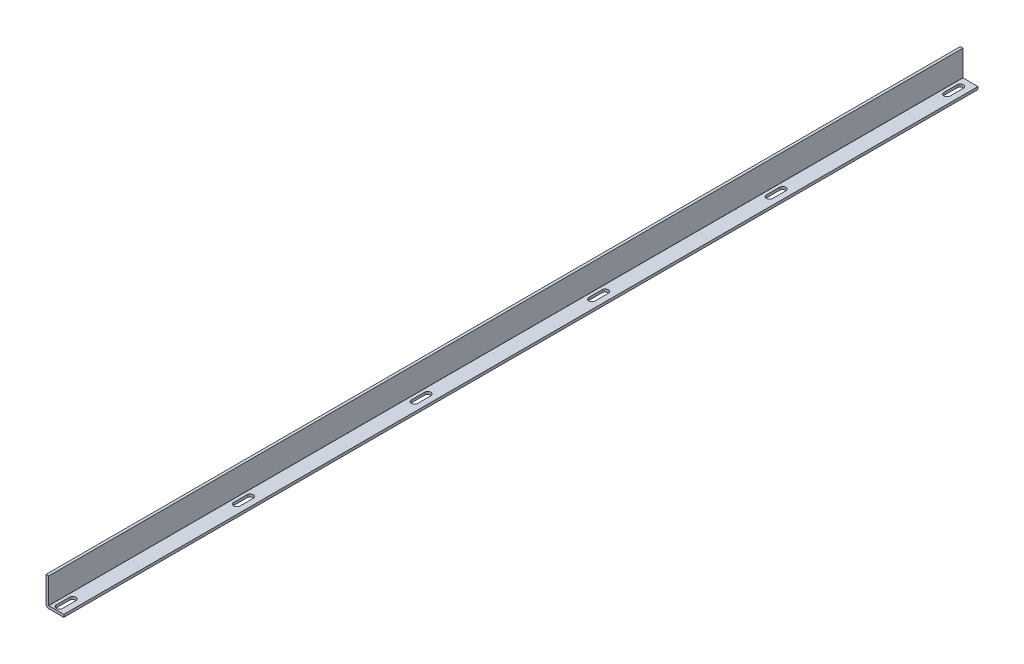
ISO-10303-21;
HEADER;
FILE_DESCRIPTION(('STEP AP214'),'2;1');
FILE_NAME('part.step','',(''),(''),'','','');
FILE_SCHEMA(('AUTOMOTIVE_DESIGN { 1 0 10303 214 1 1 1 1 }'));
ENDSEC;
DATA;
#1=APPLICATION_CONTEXT('core data for automotive mechanical design processes');
#2=APPLICATION_PROTOCOL_DEFINITION('international standard','automotive_design',2000,#1);
#3=PRODUCT_CONTEXT('',#1,'mechanical');
#4=PRODUCT('Part','Part','',(#3));
#5=PRODUCT_RELATED_PRODUCT_CATEGORY('part','',(#4));
#6=PRODUCT_DEFINITION_FORMATION('','',#4);
#7=PRODUCT_DEFINITION_CONTEXT('part definition',#1,'design');
#8=PRODUCT_DEFINITION('design','',#6,#7);
#9=PRODUCT_DEFINITION_SHAPE('','',#8);
#10=(LENGTH_UNIT() NAMED_UNIT(*) SI_UNIT(.MILLI.,.METRE.));
#11=(NAMED_UNIT(*) PLANE_ANGLE_UNIT() SI_UNIT($,.RADIAN.));
#12=(NAMED_UNIT(*) SI_UNIT($,.STERADIAN.) SOLID_ANGLE_UNIT());
#13=UNCERTAINTY_MEASURE_WITH_UNIT(LENGTH_MEASURE(1.E-05),#10,'distance_accuracy_value','');
#14=(GEOMETRIC_REPRESENTATION_CONTEXT(3) GLOBAL_UNCERTAINTY_ASSIGNED_CONTEXT((#13)) GLOBAL_UNIT_ASSIGNED_CONTEXT((#10,
#11,#12)) REPRESENTATION_CONTEXT('',''));
#15=CARTESIAN_POINT('',(0.,0.,0.));
#16=DIRECTION('',(0.,0.,1.));
#17=DIRECTION('',(1.,0.,0.));
#18=AXIS2_PLACEMENT_3D('',#15,#16,#17);
#19=CARTESIAN_POINT('',(-1146.50000000005,-1240.,860.));
#20=DIRECTION('',(-1.,0.,0.));
#21=DIRECTION('',(0.,0.,1.));
#22=AXIS2_PLACEMENT_3D('',#19,#20,#21);
#23=PLANE('',#22);
#24=DIRECTION('',(0.,-1.,0.));
#25=VECTOR('',#24,1.);
#26=CARTESIAN_POINT('',(-1146.50000000005,-1240.,245.));
#27=LINE('',#26,#25);
#28=CARTESIAN_POINT('',(-1146.50000000005,-1237.,245.));
#29=VERTEX_POINT('',#28);
#30=CARTESIAN_POINT('',(-1146.50000000005,-1240.,245.));
#31=VERTEX_POINT('',#30);
#32=EDGE_CURVE('E11',#29,#31,#27,.T.);
#33=ORIENTED_EDGE('',*,*,#32,.F.);
#34=DIRECTION('',(0.,0.,1.));
#35=VECTOR('',#34,1.);
#36=CARTESIAN_POINT('',(-1146.50000000005,-1237.,860.));
#37=LINE('',#36,#35);
#38=CARTESIAN_POINT('',(-1146.50000000005,-1237.,230.));
#39=VERTEX_POINT('',#38);
#40=EDGE_CURVE('E160',#39,#29,#37,.T.);
#41=ORIENTED_EDGE('',*,*,#40,.F.);
#42=DIRECTION('',(0.,-1.,0.));
#43=VECTOR('',#42,1.);
#44=CARTESIAN_POINT('',(-1146.50000000005,-1240.,230.));
#45=LINE('',#44,#43);
#46=CARTESIAN_POINT('',(-1146.50000000005,-1240.,230.));
#47=VERTEX_POINT('',#46);
#48=EDGE_CURVE('E26',#39,#47,#45,.T.);
#49=ORIENTED_EDGE('',*,*,#48,.T.);
#50=DIRECTION('',(0.,0.,1.));
#51=VECTOR('',#50,1.);
#52=CARTESIAN_POINT('',(-1146.50000000005,-1240.,860.));
#53=LINE('',#52,#51);
#54=EDGE_CURVE('E262',#47,#31,#53,.T.);
#55=ORIENTED_EDGE('',*,*,#54,.T.);
#56=EDGE_LOOP('',(#33,#41,#49,#55));
#57=FACE_BOUND('',#56,.T.);
#58=ADVANCED_FACE('F16',(#57),#23,.T.);
#59=CARTESIAN_POINT('',(-1150.00000000005,-1240.,230.));
#60=DIRECTION('',(0.,1.,0.));
#61=DIRECTION('',(-1.,0.,0.));
#62=AXIS2_PLACEMENT_3D('',#59,#60,#61);
#63=CYLINDRICAL_SURFACE('',#62,3.49999999999984);
#64=ORIENTED_EDGE('',*,*,#48,.F.);
#65=CARTESIAN_POINT('',(-1150.00000000005,-1237.,230.));
#66=DIRECTION('',(0.,1.,0.));
#67=DIRECTION('',(-1.,0.,0.));
#68=AXIS2_PLACEMENT_3D('',#65,#66,#67);
#69=CIRCLE('',#68,3.49999999999984);
#70=CARTESIAN_POINT('',(-1153.50000000005,-1237.,230.));
#71=VERTEX_POINT('',#70);
#72=EDGE_CURVE('E173',#71,#39,#69,.F.);
#73=ORIENTED_EDGE('',*,*,#72,.F.);
#74=DIRECTION('',(0.,-1.,0.));
#75=VECTOR('',#74,1.);
#76=CARTESIAN_POINT('',(-1153.50000000005,-1240.,230.));
#77=LINE('',#76,#75);
#78=CARTESIAN_POINT('',(-1153.50000000005,-1240.,230.));
#79=VERTEX_POINT('',#78);
#80=EDGE_CURVE('E151',#71,#79,#77,.T.);
#81=ORIENTED_EDGE('',*,*,#80,.T.);
#82=CARTESIAN_POINT('',(-1150.00000000005,-1240.,230.));
#83=DIRECTION('',(0.,1.,0.));
#84=DIRECTION('',(-1.,0.,0.));
#85=AXIS2_PLACEMENT_3D('',#82,#83,#84);
#86=CIRCLE('',#85,3.49999999999984);
#87=EDGE_CURVE('E271',#79,#47,#86,.F.);
#88=ORIENTED_EDGE('',*,*,#87,.T.);
#89=EDGE_LOOP('',(#64,#73,#81,#88));
#90=FACE_BOUND('',#89,.T.);
#91=ADVANCED_FACE('F273',(#90),#63,.F.);
#92=CARTESIAN_POINT('',(-1153.50000000005,-1240.,860.));
#93=DIRECTION('',(-1.,0.,0.));
#94=DIRECTION('',(0.,0.,1.));
#95=AXIS2_PLACEMENT_3D('',#92,#93,#94);
#96=PLANE('',#95);
#97=ORIENTED_EDGE('',*,*,#80,.F.);
#98=DIRECTION('',(0.,0.,1.));
#99=VECTOR('',#98,1.);
#100=CARTESIAN_POINT('',(-1153.50000000005,-1237.,860.));
#101=LINE('',#100,#99);
#102=CARTESIAN_POINT('',(-1153.50000000005,-1237.,245.));
#103=VERTEX_POINT('',#102);
#104=EDGE_CURVE('E158',#103,#71,#101,.F.);
#105=ORIENTED_EDGE('',*,*,#104,.F.);
#106=DIRECTION('',(0.,-1.,0.));
#107=VECTOR('',#106,1.);
#108=CARTESIAN_POINT('',(-1153.50000000005,-1240.,245.));
#109=LINE('',#108,#107);
#110=CARTESIAN_POINT('',(-1153.50000000005,-1240.,245.));
#111=VERTEX_POINT('',#110);
#112=EDGE_CURVE('E20',#103,#111,#109,.T.);
#113=ORIENTED_EDGE('',*,*,#112,.T.);
#114=DIRECTION('',(0.,0.,1.));
#115=VECTOR('',#114,1.);
#116=CARTESIAN_POINT('',(-1153.50000000005,-1240.,860.));
#117=LINE('',#116,#115);
#118=EDGE_CURVE('E830',#111,#79,#117,.F.);
#119=ORIENTED_EDGE('',*,*,#118,.T.);
#120=EDGE_LOOP('',(#97,#105,#113,#119));
#121=FACE_BOUND('',#120,.T.);
#122=ADVANCED_FACE('F162',(#121),#96,.F.);
#123=CARTESIAN_POINT('',(-1146.50000000005,-1240.,860.));
#124=DIRECTION('',(-1.,0.,0.));
#125=DIRECTION('',(0.,0.,1.));
#126=AXIS2_PLACEMENT_3D('',#123,#124,#125);
#127=PLANE('',#126);
#128=DIRECTION('',(0.,-1.,0.));
#129=VECTOR('',#128,1.);
#130=CARTESIAN_POINT('',(-1146.50000000005,-1240.,44.9999999999997));
#131=LINE('',#130,#129);
#132=CARTESIAN_POINT('',(-1146.50000000005,-1237.,44.9999999999997));
#133=VERTEX_POINT('',#132);
#134=CARTESIAN_POINT('',(-1146.50000000005,-1240.,44.9999999999997));
#135=VERTEX_POINT('',#134);
#136=EDGE_CURVE('E152',#133,#135,#131,.T.);
#137=ORIENTED_EDGE('',*,*,#136,.F.);
#138=DIRECTION('',(0.,0.,1.));
#139=VECTOR('',#138,1.);
#140=CARTESIAN_POINT('',(-1146.50000000005,-1237.,860.));
#141=LINE('',#140,#139);
#142=CARTESIAN_POINT('',(-1146.50000000005,-1237.,29.9999999999997));
#143=VERTEX_POINT('',#142);
#144=EDGE_CURVE('E167',#143,#133,#141,.T.);
#145=ORIENTED_EDGE('',*,*,#144,.F.);
#146=DIRECTION('',(0.,-1.,0.));
#147=VECTOR('',#146,1.);
#148=CARTESIAN_POINT('',(-1146.50000000005,-1240.,29.9999999999997));
#149=LINE('',#148,#147);
#150=CARTESIAN_POINT('',(-1146.50000000005,-1240.,29.9999999999997));
#151=VERTEX_POINT('',#150);
#152=EDGE_CURVE('E250',#143,#151,#149,.T.);
#153=ORIENTED_EDGE('',*,*,#152,.T.);
#154=DIRECTION('',(0.,0.,1.));
#155=VECTOR('',#154,1.);
#156=CARTESIAN_POINT('',(-1146.50000000005,-1240.,860.));
#157=LINE('',#156,#155);
#158=EDGE_CURVE('E826',#151,#135,#157,.T.);
#159=ORIENTED_EDGE('',*,*,#158,.T.);
#160=EDGE_LOOP('',(#137,#145,#153,#159));
#161=FACE_BOUND('',#160,.T.);
#162=ADVANCED_FACE('F481',(#161),#127,.T.);
#163=CARTESIAN_POINT('',(-1150.00000000005,-1240.,29.9999999999997));
#164=DIRECTION('',(0.,1.,0.));
#165=DIRECTION('',(-1.,0.,0.));
#166=AXIS2_PLACEMENT_3D('',#163,#164,#165);
#167=CYLINDRICAL_SURFACE('',#166,3.49999999999984);
#168=ORIENTED_EDGE('',*,*,#152,.F.);
#169=CARTESIAN_POINT('',(-1150.00000000005,-1237.,29.9999999999997));
#170=DIRECTION('',(0.,1.,0.));
#171=DIRECTION('',(-1.,0.,0.));
#172=AXIS2_PLACEMENT_3D('',#169,#170,#171);
#173=CIRCLE('',#172,3.49999999999984);
#174=CARTESIAN_POINT('',(-1153.50000000005,-1237.,29.9999999999997));
#175=VERTEX_POINT('',#174);
#176=EDGE_CURVE('E164',#175,#143,#173,.F.);
#177=ORIENTED_EDGE('',*,*,#176,.F.);
#178=DIRECTION('',(0.,-1.,0.));
#179=VECTOR('',#178,1.);
#180=CARTESIAN_POINT('',(-1153.50000000005,-1240.,29.9999999999997));
#181=LINE('',#180,#179);
#182=CARTESIAN_POINT('',(-1153.50000000005,-1240.,29.9999999999997));
#183=VERTEX_POINT('',#182);
#184=EDGE_CURVE('E247',#175,#183,#181,.T.);
#185=ORIENTED_EDGE('',*,*,#184,.T.);
#186=CARTESIAN_POINT('',(-1150.00000000005,-1240.,29.9999999999997));
#187=DIRECTION('',(0.,1.,0.));
#188=DIRECTION('',(-1.,0.,0.));
#189=AXIS2_PLACEMENT_3D('',#186,#187,#188);
#190=CIRCLE('',#189,3.49999999999984);
#191=EDGE_CURVE('E411',#183,#151,#190,.F.);
#192=ORIENTED_EDGE('',*,*,#191,.T.);
#193=EDGE_LOOP('',(#168,#177,#185,#192));
#194=FACE_BOUND('',#193,.T.);
#195=ADVANCED_FACE('F409',(#194),#167,.F.);
#196=CARTESIAN_POINT('',(-1153.50000000005,-1240.,860.));
#197=DIRECTION('',(-1.,0.,0.));
#198=DIRECTION('',(0.,0.,1.));
#199=AXIS2_PLACEMENT_3D('',#196,#197,#198);
#200=PLANE('',#199);
#201=ORIENTED_EDGE('',*,*,#184,.F.);
#202=DIRECTION('',(0.,0.,1.));
#203=VECTOR('',#202,1.);
#204=CARTESIAN_POINT('',(-1153.50000000005,-1237.,860.));
#205=LINE('',#204,#203);
#206=CARTESIAN_POINT('',(-1153.50000000005,-1237.,44.9999999999997));
#207=VERTEX_POINT('',#206);
#208=EDGE_CURVE('E384',#207,#175,#205,.F.);
#209=ORIENTED_EDGE('',*,*,#208,.F.);
#210=DIRECTION('',(0.,-1.,0.));
#211=VECTOR('',#210,1.);
#212=CARTESIAN_POINT('',(-1153.50000000005,-1240.,44.9999999999997));
#213=LINE('',#212,#211);
#214=CARTESIAN_POINT('',(-1153.50000000005,-1240.,44.9999999999997));
#215=VERTEX_POINT('',#214);
#216=EDGE_CURVE('E244',#207,#215,#213,.T.);
#217=ORIENTED_EDGE('',*,*,#216,.T.);
#218=DIRECTION('',(0.,0.,1.));
#219=VECTOR('',#218,1.);
#220=CARTESIAN_POINT('',(-1153.50000000005,-1240.,860.));
#221=LINE('',#220,#219);
#222=EDGE_CURVE('E405',#215,#183,#221,.F.);
#223=ORIENTED_EDGE('',*,*,#222,.T.);
#224=EDGE_LOOP('',(#201,#209,#217,#223));
#225=FACE_BOUND('',#224,.T.);
#226=ADVANCED_FACE('F400',(#225),#200,.F.);
#227=CARTESIAN_POINT('',(-1146.50000000005,-1240.,860.));
#228=DIRECTION('',(-1.,0.,0.));
#229=DIRECTION('',(0.,0.,1.));
#230=AXIS2_PLACEMENT_3D('',#227,#228,#229);
#231=PLANE('',#230);
#232=DIRECTION('',(0.,-1.,0.));
#233=VECTOR('',#232,1.);
#234=CARTESIAN_POINT('',(-1146.50000000005,-1240.,-155.));
#235=LINE('',#234,#233);
#236=CARTESIAN_POINT('',(-1146.50000000005,-1237.,-155.));
#237=VERTEX_POINT('',#236);
#238=CARTESIAN_POINT('',(-1146.50000000005,-1240.,-155.));
#239=VERTEX_POINT('',#238);
#240=EDGE_CURVE('E241',#237,#239,#235,.T.);
#241=ORIENTED_EDGE('',*,*,#240,.F.);
#242=DIRECTION('',(0.,0.,1.));
#243=VECTOR('',#242,1.);
#244=CARTESIAN_POINT('',(-1146.50000000005,-1237.,860.));
#245=LINE('',#244,#243);
#246=CARTESIAN_POINT('',(-1146.50000000005,-1237.,-170.));
#247=VERTEX_POINT('',#246);
#248=EDGE_CURVE('E385',#247,#237,#245,.T.);
#249=ORIENTED_EDGE('',*,*,#248,.F.);
#250=DIRECTION('',(0.,-1.,0.));
#251=VECTOR('',#250,1.);
#252=CARTESIAN_POINT('',(-1146.50000000005,-1240.,-170.));
#253=LINE('',#252,#251);
#254=CARTESIAN_POINT('',(-1146.50000000005,-1240.,-170.));
#255=VERTEX_POINT('',#254);
#256=EDGE_CURVE('E238',#247,#255,#253,.T.);
#257=ORIENTED_EDGE('',*,*,#256,.T.);
#258=DIRECTION('',(0.,0.,1.));
#259=VECTOR('',#258,1.);
#260=CARTESIAN_POINT('',(-1146.50000000005,-1240.,860.));
#261=LINE('',#260,#259);
#262=EDGE_CURVE('E813',#255,#239,#261,.T.);
#263=ORIENTED_EDGE('',*,*,#262,.T.);
#264=EDGE_LOOP('',(#241,#249,#257,#263));
#265=FACE_BOUND('',#264,.T.);
#266=ADVANCED_FACE('F493',(#265),#231,.T.);
#267=CARTESIAN_POINT('',(-1150.00000000005,-1240.,-170.));
#268=DIRECTION('',(0.,1.,0.));
#269=DIRECTION('',(-1.,0.,0.));
#270=AXIS2_PLACEMENT_3D('',#267,#268,#269);
#271=CYLINDRICAL_SURFACE('',#270,3.49999999999984);
#272=ORIENTED_EDGE('',*,*,#256,.F.);
#273=CARTESIAN_POINT('',(-1150.00000000005,-1237.,-170.));
#274=DIRECTION('',(0.,1.,0.));
#275=DIRECTION('',(-1.,0.,0.));
#276=AXIS2_PLACEMENT_3D('',#273,#274,#275);
#277=CIRCLE('',#276,3.49999999999984);
#278=CARTESIAN_POINT('',(-1153.50000000005,-1237.,-170.));
#279=VERTEX_POINT('',#278);
#280=EDGE_CURVE('E381',#279,#247,#277,.F.);
#281=ORIENTED_EDGE('',*,*,#280,.F.);
#282=DIRECTION('',(0.,-1.,0.));
#283=VECTOR('',#282,1.);
#284=CARTESIAN_POINT('',(-1153.50000000005,-1240.,-170.));
#285=LINE('',#284,#283);
#286=CARTESIAN_POINT('',(-1153.50000000005,-1240.,-170.));
#287=VERTEX_POINT('',#286);
#288=EDGE_CURVE('E235',#279,#287,#285,.T.);
#289=ORIENTED_EDGE('',*,*,#288,.T.);
#290=CARTESIAN_POINT('',(-1150.00000000005,-1240.,-170.));
#291=DIRECTION('',(0.,1.,0.));
#292=DIRECTION('',(-1.,0.,0.));
#293=AXIS2_PLACEMENT_3D('',#290,#291,#292);
#294=CIRCLE('',#293,3.49999999999984);
#295=EDGE_CURVE('E797',#287,#255,#294,.F.);
#296=ORIENTED_EDGE('',*,*,#295,.T.);
#297=EDGE_LOOP('',(#272,#281,#289,#296));
#298=FACE_BOUND('',#297,.T.);
#299=ADVANCED_FACE('F500',(#298),#271,.F.);
#300=CARTESIAN_POINT('',(-1153.50000000005,-1240.,860.));
#301=DIRECTION('',(-1.,0.,0.));
#302=DIRECTION('',(0.,0.,1.));
#303=AXIS2_PLACEMENT_3D('',#300,#301,#302);
#304=PLANE('',#303);
#305=ORIENTED_EDGE('',*,*,#288,.F.);
#306=DIRECTION('',(0.,0.,1.));
#307=VECTOR('',#306,1.);
#308=CARTESIAN_POINT('',(-1153.50000000005,-1237.,860.));
#309=LINE('',#308,#307);
#310=CARTESIAN_POINT('',(-1153.50000000005,-1237.,-155.));
#311=VERTEX_POINT('',#310);
#312=EDGE_CURVE('E372',#311,#279,#309,.F.);
#313=ORIENTED_EDGE('',*,*,#312,.F.);
#314=DIRECTION('',(0.,-1.,0.));
#315=VECTOR('',#314,1.);
#316=CARTESIAN_POINT('',(-1153.50000000005,-1240.,-155.));
#317=LINE('',#316,#315);
#318=CARTESIAN_POINT('',(-1153.50000000005,-1240.,-155.));
#319=VERTEX_POINT('',#318);
#320=EDGE_CURVE('E232',#311,#319,#317,.T.);
#321=ORIENTED_EDGE('',*,*,#320,.T.);
#322=DIRECTION('',(0.,0.,1.));
#323=VECTOR('',#322,1.);
#324=CARTESIAN_POINT('',(-1153.50000000005,-1240.,860.));
#325=LINE('',#324,#323);
#326=EDGE_CURVE('E806',#319,#287,#325,.F.);
#327=ORIENTED_EDGE('',*,*,#326,.T.);
#328=EDGE_LOOP('',(#305,#313,#321,#327));
#329=FACE_BOUND('',#328,.T.);
#330=ADVANCED_FACE('F504',(#329),#304,.F.);
#331=CARTESIAN_POINT('',(-1146.50000000005,-1240.,860.));
#332=DIRECTION('',(-1.,0.,0.));
#333=DIRECTION('',(0.,0.,1.));
#334=AXIS2_PLACEMENT_3D('',#331,#332,#333);
#335=PLANE('',#334);
#336=DIRECTION('',(0.,-1.,0.));
#337=VECTOR('',#336,1.);
#338=CARTESIAN_POINT('',(-1146.50000000005,-1240.,-355.));
#339=LINE('',#338,#337);
#340=CARTESIAN_POINT('',(-1146.50000000005,-1237.,-355.));
#341=VERTEX_POINT('',#340);
#342=CARTESIAN_POINT('',(-1146.50000000005,-1240.,-355.));
#343=VERTEX_POINT('',#342);
#344=EDGE_CURVE('E229',#341,#343,#339,.T.);
#345=ORIENTED_EDGE('',*,*,#344,.F.);
#346=DIRECTION('',(0.,0.,1.));
#347=VECTOR('',#346,1.);
#348=CARTESIAN_POINT('',(-1146.50000000005,-1237.,860.));
#349=LINE('',#348,#347);
#350=CARTESIAN_POINT('',(-1146.50000000005,-1237.,-370.));
#351=VERTEX_POINT('',#350);
#352=EDGE_CURVE('E373',#351,#341,#349,.T.);
#353=ORIENTED_EDGE('',*,*,#352,.F.);
#354=DIRECTION('',(0.,-1.,0.));
#355=VECTOR('',#354,1.);
#356=CARTESIAN_POINT('',(-1146.50000000005,-1240.,-370.));
#357=LINE('',#356,#355);
#358=CARTESIAN_POINT('',(-1146.50000000005,-1240.,-370.));
#359=VERTEX_POINT('',#358);
#360=EDGE_CURVE('E226',#351,#359,#357,.T.);
#361=ORIENTED_EDGE('',*,*,#360,.T.);
#362=DIRECTION('',(0.,0.,1.));
#363=VECTOR('',#362,1.);
#364=CARTESIAN_POINT('',(-1146.50000000005,-1240.,860.));
#365=LINE('',#364,#363);
#366=EDGE_CURVE('E816',#359,#343,#365,.T.);
#367=ORIENTED_EDGE('',*,*,#366,.T.);
#368=EDGE_LOOP('',(#345,#353,#361,#367));
#369=FACE_BOUND('',#368,.T.);
#370=ADVANCED_FACE('F508',(#369),#335,.T.);
#371=CARTESIAN_POINT('',(-1150.00000000005,-1240.,-370.));
#372=DIRECTION('',(0.,1.,0.));
#373=DIRECTION('',(-1.,0.,0.));
#374=AXIS2_PLACEMENT_3D('',#371,#372,#373);
#375=CYLINDRICAL_SURFACE('',#374,3.49999999999984);
#376=ORIENTED_EDGE('',*,*,#360,.F.);
#377=CARTESIAN_POINT('',(-1150.00000000005,-1237.,-370.));
#378=DIRECTION('',(0.,1.,0.));
#379=DIRECTION('',(-1.,0.,0.));
#380=AXIS2_PLACEMENT_3D('',#377,#378,#379);
#381=CIRCLE('',#380,3.49999999999984);
#382=CARTESIAN_POINT('',(-1153.50000000005,-1237.,-370.));
#383=VERTEX_POINT('',#382);
#384=EDGE_CURVE('E369',#383,#351,#381,.F.);
#385=ORIENTED_EDGE('',*,*,#384,.F.);
#386=DIRECTION('',(0.,-1.,0.));
#387=VECTOR('',#386,1.);
#388=CARTESIAN_POINT('',(-1153.50000000005,-1240.,-370.));
#389=LINE('',#388,#387);
#390=CARTESIAN_POINT('',(-1153.50000000005,-1240.,-370.));
#391=VERTEX_POINT('',#390);
#392=EDGE_CURVE('E223',#383,#391,#389,.T.);
#393=ORIENTED_EDGE('',*,*,#392,.T.);
#394=CARTESIAN_POINT('',(-1150.00000000005,-1240.,-370.));
#395=DIRECTION('',(0.,1.,0.));
#396=DIRECTION('',(-1.,0.,0.));
#397=AXIS2_PLACEMENT_3D('',#394,#395,#396);
#398=CIRCLE('',#397,3.49999999999984);
#399=EDGE_CURVE('E811',#391,#359,#398,.F.);
#400=ORIENTED_EDGE('',*,*,#399,.T.);
#401=EDGE_LOOP('',(#376,#385,#393,#400));
#402=FACE_BOUND('',#401,.T.);
#403=ADVANCED_FACE('F516',(#402),#375,.F.);
#404=CARTESIAN_POINT('',(-1153.50000000005,-1240.,860.));
#405=DIRECTION('',(-1.,0.,0.));
#406=DIRECTION('',(0.,0.,1.));
#407=AXIS2_PLACEMENT_3D('',#404,#405,#406);
#408=PLANE('',#407);
#409=ORIENTED_EDGE('',*,*,#392,.F.);
#410=DIRECTION('',(0.,0.,1.));
#411=VECTOR('',#410,1.);
#412=CARTESIAN_POINT('',(-1153.50000000005,-1237.,860.));
#413=LINE('',#412,#411);
#414=CARTESIAN_POINT('',(-1153.50000000005,-1237.,-355.));
#415=VERTEX_POINT('',#414);
#416=EDGE_CURVE('E360',#415,#383,#413,.F.);
#417=ORIENTED_EDGE('',*,*,#416,.F.);
#418=DIRECTION('',(0.,-1.,0.));
#419=VECTOR('',#418,1.);
#420=CARTESIAN_POINT('',(-1153.50000000005,-1240.,-355.));
#421=LINE('',#420,#419);
#422=CARTESIAN_POINT('',(-1153.50000000005,-1240.,-355.));
#423=VERTEX_POINT('',#422);
#424=EDGE_CURVE('E220',#415,#423,#421,.T.);
#425=ORIENTED_EDGE('',*,*,#424,.T.);
#426=DIRECTION('',(0.,0.,1.));
#427=VECTOR('',#426,1.);
#428=CARTESIAN_POINT('',(-1153.50000000005,-1240.,860.));
#429=LINE('',#428,#427);
#430=EDGE_CURVE('E889',#423,#391,#429,.F.);
#431=ORIENTED_EDGE('',*,*,#430,.T.);
#432=EDGE_LOOP('',(#409,#417,#425,#431));
#433=FACE_BOUND('',#432,.T.);
#434=ADVANCED_FACE('F520',(#433),#408,.F.);
#435=CARTESIAN_POINT('',(-1146.50000000005,-1240.,860.));
#436=DIRECTION('',(-1.,0.,0.));
#437=DIRECTION('',(0.,0.,1.));
#438=AXIS2_PLACEMENT_3D('',#435,#436,#437);
#439=PLANE('',#438);
#440=DIRECTION('',(0.,-1.,0.));
#441=VECTOR('',#440,1.);
#442=CARTESIAN_POINT('',(-1146.50000000005,-1240.,-555.));
#443=LINE('',#442,#441);
#444=CARTESIAN_POINT('',(-1146.50000000005,-1237.,-555.));
#445=VERTEX_POINT('',#444);
#446=CARTESIAN_POINT('',(-1146.50000000005,-1240.,-555.));
#447=VERTEX_POINT('',#446);
#448=EDGE_CURVE('E217',#445,#447,#443,.T.);
#449=ORIENTED_EDGE('',*,*,#448,.F.);
#450=DIRECTION('',(0.,0.,1.));
#451=VECTOR('',#450,1.);
#452=CARTESIAN_POINT('',(-1146.50000000005,-1237.,860.));
#453=LINE('',#452,#451);
#454=CARTESIAN_POINT('',(-1146.50000000005,-1237.,-570.));
#455=VERTEX_POINT('',#454);
#456=EDGE_CURVE('E361',#455,#445,#453,.T.);
#457=ORIENTED_EDGE('',*,*,#456,.F.);
#458=DIRECTION('',(0.,-1.,0.));
#459=VECTOR('',#458,1.);
#460=CARTESIAN_POINT('',(-1146.50000000005,-1240.,-570.));
#461=LINE('',#460,#459);
#462=CARTESIAN_POINT('',(-1146.50000000005,-1240.,-570.));
#463=VERTEX_POINT('',#462);
#464=EDGE_CURVE('E214',#455,#463,#461,.T.);
#465=ORIENTED_EDGE('',*,*,#464,.T.);
#466=DIRECTION('',(0.,0.,1.));
#467=VECTOR('',#466,1.);
#468=CARTESIAN_POINT('',(-1146.50000000005,-1240.,860.));
#469=LINE('',#468,#467);
#470=EDGE_CURVE('E883',#463,#447,#469,.T.);
#471=ORIENTED_EDGE('',*,*,#470,.T.);
#472=EDGE_LOOP('',(#449,#457,#465,#471));
#473=FACE_BOUND('',#472,.T.);
#474=ADVANCED_FACE('F524',(#473),#439,.T.);
#475=CARTESIAN_POINT('',(-1150.00000000005,-1240.,-570.));
#476=DIRECTION('',(0.,1.,0.));
#477=DIRECTION('',(-1.,0.,0.));
#478=AXIS2_PLACEMENT_3D('',#475,#476,#477);
#479=CYLINDRICAL_SURFACE('',#478,3.49999999999984);
#480=ORIENTED_EDGE('',*,*,#464,.F.);
#481=CARTESIAN_POINT('',(-1150.00000000005,-1237.,-570.));
#482=DIRECTION('',(0.,1.,0.));
#483=DIRECTION('',(-1.,0.,0.));
#484=AXIS2_PLACEMENT_3D('',#481,#482,#483);
#485=CIRCLE('',#484,3.49999999999984);
#486=CARTESIAN_POINT('',(-1153.50000000005,-1237.,-570.));
#487=VERTEX_POINT('',#486);
#488=EDGE_CURVE('E357',#487,#455,#485,.F.);
#489=ORIENTED_EDGE('',*,*,#488,.F.);
#490=DIRECTION('',(0.,-1.,0.));
#491=VECTOR('',#490,1.);
#492=CARTESIAN_POINT('',(-1153.50000000005,-1240.,-570.));
#493=LINE('',#492,#491);
#494=CARTESIAN_POINT('',(-1153.50000000005,-1240.,-570.));
#495=VERTEX_POINT('',#494);
#496=EDGE_CURVE('E211',#487,#495,#493,.T.);
#497=ORIENTED_EDGE('',*,*,#496,.T.);
#498=CARTESIAN_POINT('',(-1150.00000000005,-1240.,-570.));
#499=DIRECTION('',(0.,1.,0.));
#500=DIRECTION('',(-1.,0.,0.));
#501=AXIS2_PLACEMENT_3D('',#498,#499,#500);
#502=CIRCLE('',#501,3.49999999999984);
#503=EDGE_CURVE('E886',#495,#463,#502,.F.);
#504=ORIENTED_EDGE('',*,*,#503,.T.);
#505=EDGE_LOOP('',(#480,#489,#497,#504));
#506=FACE_BOUND('',#505,.T.);
#507=ADVANCED_FACE('F532',(#506),#479,.F.);
#508=CARTESIAN_POINT('',(-1153.50000000005,-1240.,860.));
#509=DIRECTION('',(-1.,0.,0.));
#510=DIRECTION('',(0.,0.,1.));
#511=AXIS2_PLACEMENT_3D('',#508,#509,#510);
#512=PLANE('',#511);
#513=ORIENTED_EDGE('',*,*,#496,.F.);
#514=DIRECTION('',(0.,0.,1.));
#515=VECTOR('',#514,1.);
#516=CARTESIAN_POINT('',(-1153.50000000005,-1237.,860.));
#517=LINE('',#516,#515);
#518=CARTESIAN_POINT('',(-1153.50000000005,-1237.,-555.));
#519=VERTEX_POINT('',#518);
#520=EDGE_CURVE('E348',#519,#487,#517,.F.);
#521=ORIENTED_EDGE('',*,*,#520,.F.);
#522=DIRECTION('',(0.,-1.,0.));
#523=VECTOR('',#522,1.);
#524=CARTESIAN_POINT('',(-1153.50000000005,-1240.,-555.));
#525=LINE('',#524,#523);
#526=CARTESIAN_POINT('',(-1153.50000000005,-1240.,-555.));
#527=VERTEX_POINT('',#526);
#528=EDGE_CURVE('E208',#519,#527,#525,.T.);
#529=ORIENTED_EDGE('',*,*,#528,.T.);
#530=DIRECTION('',(0.,0.,1.));
#531=VECTOR('',#530,1.);
#532=CARTESIAN_POINT('',(-1153.50000000005,-1240.,860.));
#533=LINE('',#532,#531);
#534=EDGE_CURVE('E877',#527,#495,#533,.F.);
#535=ORIENTED_EDGE('',*,*,#534,.T.);
#536=EDGE_LOOP('',(#513,#521,#529,#535));
#537=FACE_BOUND('',#536,.T.);
#538=ADVANCED_FACE('F536',(#537),#512,.F.);
#539=CARTESIAN_POINT('',(-1146.50000000005,-1240.,860.));
#540=DIRECTION('',(-1.,0.,0.));
#541=DIRECTION('',(0.,0.,1.));
#542=AXIS2_PLACEMENT_3D('',#539,#540,#541);
#543=PLANE('',#542);
#544=DIRECTION('',(0.,-1.,0.));
#545=VECTOR('',#544,1.);
#546=CARTESIAN_POINT('',(-1146.50000000005,-1240.,-755.));
#547=LINE('',#546,#545);
#548=CARTESIAN_POINT('',(-1146.50000000005,-1237.,-755.));
#549=VERTEX_POINT('',#548);
#550=CARTESIAN_POINT('',(-1146.50000000005,-1240.,-755.));
#551=VERTEX_POINT('',#550);
#552=EDGE_CURVE('E205',#549,#551,#547,.T.);
#553=ORIENTED_EDGE('',*,*,#552,.F.);
#554=DIRECTION('',(0.,0.,1.));
#555=VECTOR('',#554,1.);
#556=CARTESIAN_POINT('',(-1146.50000000005,-1237.,860.));
#557=LINE('',#556,#555);
#558=CARTESIAN_POINT('',(-1146.50000000005,-1237.,-770.));
#559=VERTEX_POINT('',#558);
#560=EDGE_CURVE('E349',#559,#549,#557,.T.);
#561=ORIENTED_EDGE('',*,*,#560,.F.);
#562=DIRECTION('',(0.,-1.,0.));
#563=VECTOR('',#562,1.);
#564=CARTESIAN_POINT('',(-1146.50000000005,-1240.,-770.));
#565=LINE('',#564,#563);
#566=CARTESIAN_POINT('',(-1146.50000000005,-1240.,-770.));
#567=VERTEX_POINT('',#566);
#568=EDGE_CURVE('E202',#559,#567,#565,.T.);
#569=ORIENTED_EDGE('',*,*,#568,.T.);
#570=DIRECTION('',(0.,0.,1.));
#571=VECTOR('',#570,1.);
#572=CARTESIAN_POINT('',(-1146.50000000005,-1240.,860.));
#573=LINE('',#572,#571);
#574=EDGE_CURVE('E872',#567,#551,#573,.T.);
#575=ORIENTED_EDGE('',*,*,#574,.T.);
#576=EDGE_LOOP('',(#553,#561,#569,#575));
#577=FACE_BOUND('',#576,.T.);
#578=ADVANCED_FACE('F540',(#577),#543,.T.);
#579=CARTESIAN_POINT('',(-1150.00000000005,-1240.,-770.));
#580=DIRECTION('',(0.,1.,0.));
#581=DIRECTION('',(-1.,0.,0.));
#582=AXIS2_PLACEMENT_3D('',#579,#580,#581);
#583=CYLINDRICAL_SURFACE('',#582,3.49999999999984);
#584=ORIENTED_EDGE('',*,*,#568,.F.);
#585=CARTESIAN_POINT('',(-1150.00000000005,-1237.,-770.));
#586=DIRECTION('',(0.,1.,0.));
#587=DIRECTION('',(-1.,0.,0.));
#588=AXIS2_PLACEMENT_3D('',#585,#586,#587);
#589=CIRCLE('',#588,3.49999999999984);
#590=CARTESIAN_POINT('',(-1153.50000000005,-1237.,-770.));
#591=VERTEX_POINT('',#590);
#592=EDGE_CURVE('E345',#591,#559,#589,.F.);
#593=ORIENTED_EDGE('',*,*,#592,.F.);
#594=DIRECTION('',(0.,-1.,0.));
#595=VECTOR('',#594,1.);
#596=CARTESIAN_POINT('',(-1153.50000000005,-1240.,-770.));
#597=LINE('',#596,#595);
#598=CARTESIAN_POINT('',(-1153.50000000005,-1240.,-770.));
#599=VERTEX_POINT('',#598);
#600=EDGE_CURVE('E199',#591,#599,#597,.T.);
#601=ORIENTED_EDGE('',*,*,#600,.T.);
#602=CARTESIAN_POINT('',(-1150.00000000005,-1240.,-770.));
#603=DIRECTION('',(0.,1.,0.));
#604=DIRECTION('',(-1.,0.,0.));
#605=AXIS2_PLACEMENT_3D('',#602,#603,#604);
#606=CIRCLE('',#605,3.49999999999984);
#607=EDGE_CURVE('E870',#599,#567,#606,.F.);
#608=ORIENTED_EDGE('',*,*,#607,.T.);
#609=EDGE_LOOP('',(#584,#593,#601,#608));
#610=FACE_BOUND('',#609,.T.);
#611=ADVANCED_FACE('F547',(#610),#583,.F.);
#612=CARTESIAN_POINT('',(-1153.50000000005,-1240.,860.));
#613=DIRECTION('',(-1.,0.,0.));
#614=DIRECTION('',(0.,0.,1.));
#615=AXIS2_PLACEMENT_3D('',#612,#613,#614);
#616=PLANE('',#615);
#617=ORIENTED_EDGE('',*,*,#600,.F.);
#618=DIRECTION('',(0.,0.,1.));
#619=VECTOR('',#618,1.);
#620=CARTESIAN_POINT('',(-1153.50000000005,-1237.,860.));
#621=LINE('',#620,#619);
#622=CARTESIAN_POINT('',(-1153.50000000005,-1237.,-755.));
#623=VERTEX_POINT('',#622);
#624=EDGE_CURVE('E331',#623,#591,#621,.F.);
#625=ORIENTED_EDGE('',*,*,#624,.F.);
#626=DIRECTION('',(0.,-1.,0.));
#627=VECTOR('',#626,1.);
#628=CARTESIAN_POINT('',(-1153.50000000005,-1240.,-755.));
#629=LINE('',#628,#627);
#630=CARTESIAN_POINT('',(-1153.50000000005,-1240.,-755.));
#631=VERTEX_POINT('',#630);
#632=EDGE_CURVE('E196',#623,#631,#629,.T.);
#633=ORIENTED_EDGE('',*,*,#632,.T.);
#634=DIRECTION('',(0.,0.,1.));
#635=VECTOR('',#634,1.);
#636=CARTESIAN_POINT('',(-1153.50000000005,-1240.,860.));
#637=LINE('',#636,#635);
#638=EDGE_CURVE('E314',#631,#599,#637,.F.);
#639=ORIENTED_EDGE('',*,*,#638,.T.);
#640=EDGE_LOOP('',(#617,#625,#633,#639));
#641=FACE_BOUND('',#640,.T.);
#642=ADVANCED_FACE('F551',(#641),#616,.F.);
#643=CARTESIAN_POINT('',(-1140.,-1240.,860.));
#644=DIRECTION('',(-1.,0.,0.));
#645=DIRECTION('',(0.,0.,1.));
#646=AXIS2_PLACEMENT_3D('',#643,#644,#645);
#647=PLANE('',#646);
#648=DIRECTION('',(0.,-1.,0.));
#649=VECTOR('',#648,1.);
#650=CARTESIAN_POINT('',(-1140.,-1240.,-780.));
#651=LINE('',#650,#649);
#652=CARTESIAN_POINT('',(-1140.,-1237.,-780.));
#653=VERTEX_POINT('',#652);
#654=CARTESIAN_POINT('',(-1140.,-1240.,-780.));
#655=VERTEX_POINT('',#654);
#656=EDGE_CURVE('E191',#653,#655,#651,.T.);
#657=ORIENTED_EDGE('',*,*,#656,.F.);
#658=DIRECTION('',(0.,0.,1.));
#659=VECTOR('',#658,1.);
#660=CARTESIAN_POINT('',(-1140.,-1237.,860.));
#661=LINE('',#660,#659);
#662=CARTESIAN_POINT('',(-1140.,-1237.,250.));
#663=VERTEX_POINT('',#662);
#664=EDGE_CURVE('E335',#663,#653,#661,.F.);
#665=ORIENTED_EDGE('',*,*,#664,.F.);
#666=DIRECTION('',(0.,-1.,0.));
#667=VECTOR('',#666,1.);
#668=CARTESIAN_POINT('',(-1140.,-1240.,250.));
#669=LINE('',#668,#667);
#670=CARTESIAN_POINT('',(-1140.,-1240.,250.));
#671=VERTEX_POINT('',#670);
#672=EDGE_CURVE('E186',#663,#671,#669,.T.);
#673=ORIENTED_EDGE('',*,*,#672,.T.);
#674=DIRECTION('',(0.,0.,1.));
#675=VECTOR('',#674,1.);
#676=CARTESIAN_POINT('',(-1140.,-1240.,860.));
#677=LINE('',#676,#675);
#678=EDGE_CURVE('E277',#671,#655,#677,.F.);
#679=ORIENTED_EDGE('',*,*,#678,.T.);
#680=EDGE_LOOP('',(#657,#665,#673,#679));
#681=FACE_BOUND('',#680,.T.);
#682=ADVANCED_FACE('F442',(#681),#647,.F.);
#683=CARTESIAN_POINT('',(-1160.,-1208.,250.));
#684=DIRECTION('',(0.,0.,-1.));
#685=DIRECTION('',(0.,1.,0.));
#686=AXIS2_PLACEMENT_3D('',#683,#684,#685);
#687=PLANE('',#686);
#688=DIRECTION('',(0.,1.,0.));
#689=VECTOR('',#688,1.);
#690=CARTESIAN_POINT('',(-1160.,-1208.,250.));
#691=LINE('',#690,#689);
#692=CARTESIAN_POINT('',(-1160.,-1208.,250.));
#693=VERTEX_POINT('',#692);
#694=CARTESIAN_POINT('',(-1160.,-1236.9,250.));
#695=VERTEX_POINT('',#694);
#696=EDGE_CURVE('E300',#693,#695,#691,.F.);
#697=ORIENTED_EDGE('',*,*,#696,.T.);
#698=CARTESIAN_POINT('',(-1156.9,-1236.9,250.));
#699=DIRECTION('',(0.,0.,-1.));
#700=DIRECTION('',(-1.,0.,0.));
#701=AXIS2_PLACEMENT_3D('',#698,#699,#700);
#702=CIRCLE('',#701,3.1);
#703=CARTESIAN_POINT('',(-1156.9,-1240.,250.));
#704=VERTEX_POINT('',#703);
#705=EDGE_CURVE('E34',#704,#695,#702,.T.);
#706=ORIENTED_EDGE('',*,*,#705,.F.);
#707=DIRECTION('',(1.,0.,0.));
#708=VECTOR('',#707,1.);
#709=CARTESIAN_POINT('',(-1200.,-1240.,250.));
#710=LINE('',#709,#708);
#711=EDGE_CURVE('E285',#671,#704,#710,.F.);
#712=ORIENTED_EDGE('',*,*,#711,.F.);
#713=ORIENTED_EDGE('',*,*,#672,.F.);
#714=DIRECTION('',(-1.,0.,0.));
#715=VECTOR('',#714,1.);
#716=CARTESIAN_POINT('',(-1160.,-1237.,250.));
#717=LINE('',#716,#715);
#718=CARTESIAN_POINT('',(-1156.9,-1237.,250.));
#719=VERTEX_POINT('',#718);
#720=EDGE_CURVE('E325',#663,#719,#717,.T.);
#721=ORIENTED_EDGE('',*,*,#720,.T.);
#722=CARTESIAN_POINT('',(-1156.9,-1236.9,250.));
#723=DIRECTION('',(0.,0.,-1.));
#724=DIRECTION('',(-1.,0.,0.));
#725=AXIS2_PLACEMENT_3D('',#722,#723,#724);
#726=CIRCLE('',#725,0.0999999999999998);
#727=CARTESIAN_POINT('',(-1157.,-1236.9,250.));
#728=VERTEX_POINT('',#727);
#729=EDGE_CURVE('E328',#719,#728,#726,.T.);
#730=ORIENTED_EDGE('',*,*,#729,.T.);
#731=DIRECTION('',(0.,1.,0.));
#732=VECTOR('',#731,1.);
#733=CARTESIAN_POINT('',(-1157.,-1208.,250.));
#734=LINE('',#733,#732);
#735=CARTESIAN_POINT('',(-1157.,-1208.,250.));
#736=VERTEX_POINT('',#735);
#737=EDGE_CURVE('E318',#736,#728,#734,.F.);
#738=ORIENTED_EDGE('',*,*,#737,.F.);
#739=DIRECTION('',(-1.,0.,0.));
#740=VECTOR('',#739,1.);
#741=CARTESIAN_POINT('',(-1160.,-1208.,250.));
#742=LINE('',#741,#740);
#743=EDGE_CURVE('E180',#736,#693,#742,.T.);
#744=ORIENTED_EDGE('',*,*,#743,.T.);
#745=EDGE_LOOP('',(#697,#706,#712,#713,#721,#730,#738,#744));
#746=FACE_BOUND('',#745,.T.);
#747=ADVANCED_FACE('F434',(#746),#687,.F.);
#748=CARTESIAN_POINT('',(-1160.,-1208.,860.));
#749=DIRECTION('',(0.,1.,0.));
#750=DIRECTION('',(0.,0.,1.));
#751=AXIS2_PLACEMENT_3D('',#748,#749,#750);
#752=PLANE('',#751);
#753=ORIENTED_EDGE('',*,*,#743,.F.);
#754=DIRECTION('',(0.,0.,1.));
#755=VECTOR('',#754,1.);
#756=CARTESIAN_POINT('',(-1157.,-1208.,860.));
#757=LINE('',#756,#755);
#758=CARTESIAN_POINT('',(-1157.,-1208.,-780.));
#759=VERTEX_POINT('',#758);
#760=EDGE_CURVE('E322',#759,#736,#757,.T.);
#761=ORIENTED_EDGE('',*,*,#760,.F.);
#762=DIRECTION('',(-1.,0.,0.));
#763=VECTOR('',#762,1.);
#764=CARTESIAN_POINT('',(-1160.,-1208.,-780.));
#765=LINE('',#764,#763);
#766=CARTESIAN_POINT('',(-1160.,-1208.,-780.));
#767=VERTEX_POINT('',#766);
#768=EDGE_CURVE('E177',#759,#767,#765,.T.);
#769=ORIENTED_EDGE('',*,*,#768,.T.);
#770=DIRECTION('',(0.,0.,1.));
#771=VECTOR('',#770,1.);
#772=CARTESIAN_POINT('',(-1160.,-1208.,860.));
#773=LINE('',#772,#771);
#774=EDGE_CURVE('E290',#767,#693,#773,.T.);
#775=ORIENTED_EDGE('',*,*,#774,.T.);
#776=EDGE_LOOP('',(#753,#761,#769,#775));
#777=FACE_BOUND('',#776,.T.);
#778=ADVANCED_FACE('F455',(#777),#752,.T.);
#779=CARTESIAN_POINT('',(-1150.00000000005,-1240.,-755.));
#780=DIRECTION('',(0.,1.,0.));
#781=DIRECTION('',(-1.,0.,0.));
#782=AXIS2_PLACEMENT_3D('',#779,#780,#781);
#783=CYLINDRICAL_SURFACE('',#782,3.49999999999984);
#784=CARTESIAN_POINT('',(-1150.00000000005,-1237.,-755.));
#785=DIRECTION('',(0.,1.,0.));
#786=DIRECTION('',(-1.,0.,0.));
#787=AXIS2_PLACEMENT_3D('',#784,#785,#786);
#788=CIRCLE('',#787,3.49999999999984);
#789=EDGE_CURVE('E344',#549,#623,#788,.F.);
#790=ORIENTED_EDGE('',*,*,#789,.F.);
#791=ORIENTED_EDGE('',*,*,#552,.T.);
#792=CARTESIAN_POINT('',(-1150.00000000005,-1240.,-755.));
#793=DIRECTION('',(0.,1.,0.));
#794=DIRECTION('',(-1.,0.,0.));
#795=AXIS2_PLACEMENT_3D('',#792,#793,#794);
#796=CIRCLE('',#795,3.49999999999984);
#797=EDGE_CURVE('E867',#551,#631,#796,.F.);
#798=ORIENTED_EDGE('',*,*,#797,.T.);
#799=ORIENTED_EDGE('',*,*,#632,.F.);
#800=EDGE_LOOP('',(#790,#791,#798,#799));
#801=FACE_BOUND('',#800,.T.);
#802=ADVANCED_FACE('F528',(#801),#783,.F.);
#803=CARTESIAN_POINT('',(-1150.00000000005,-1240.,-555.));
#804=DIRECTION('',(0.,1.,0.));
#805=DIRECTION('',(-1.,0.,0.));
#806=AXIS2_PLACEMENT_3D('',#803,#804,#805);
#807=CYLINDRICAL_SURFACE('',#806,3.49999999999984);
#808=CARTESIAN_POINT('',(-1150.00000000005,-1237.,-555.));
#809=DIRECTION('',(0.,1.,0.));
#810=DIRECTION('',(-1.,0.,0.));
#811=AXIS2_PLACEMENT_3D('',#808,#809,#810);
#812=CIRCLE('',#811,3.49999999999984);
#813=EDGE_CURVE('E356',#445,#519,#812,.F.);
#814=ORIENTED_EDGE('',*,*,#813,.F.);
#815=ORIENTED_EDGE('',*,*,#448,.T.);
#816=CARTESIAN_POINT('',(-1150.00000000005,-1240.,-555.));
#817=DIRECTION('',(0.,1.,0.));
#818=DIRECTION('',(-1.,0.,0.));
#819=AXIS2_PLACEMENT_3D('',#816,#817,#818);
#820=CIRCLE('',#819,3.49999999999984);
#821=EDGE_CURVE('E880',#447,#527,#820,.F.);
#822=ORIENTED_EDGE('',*,*,#821,.T.);
#823=ORIENTED_EDGE('',*,*,#528,.F.);
#824=EDGE_LOOP('',(#814,#815,#822,#823));
#825=FACE_BOUND('',#824,.T.);
#826=ADVANCED_FACE('F512',(#825),#807,.F.);
#827=CARTESIAN_POINT('',(-1150.00000000005,-1240.,-355.));
#828=DIRECTION('',(0.,1.,0.));
#829=DIRECTION('',(-1.,0.,0.));
#830=AXIS2_PLACEMENT_3D('',#827,#828,#829);
#831=CYLINDRICAL_SURFACE('',#830,3.49999999999984);
#832=CARTESIAN_POINT('',(-1150.00000000005,-1237.,-355.));
#833=DIRECTION('',(0.,1.,0.));
#834=DIRECTION('',(-1.,0.,0.));
#835=AXIS2_PLACEMENT_3D('',#832,#833,#834);
#836=CIRCLE('',#835,3.49999999999984);
#837=EDGE_CURVE('E368',#341,#415,#836,.F.);
#838=ORIENTED_EDGE('',*,*,#837,.F.);
#839=ORIENTED_EDGE('',*,*,#344,.T.);
#840=CARTESIAN_POINT('',(-1150.00000000005,-1240.,-355.));
#841=DIRECTION('',(0.,1.,0.));
#842=DIRECTION('',(-1.,0.,0.));
#843=AXIS2_PLACEMENT_3D('',#840,#841,#842);
#844=CIRCLE('',#843,3.49999999999984);
#845=EDGE_CURVE('E892',#343,#423,#844,.F.);
#846=ORIENTED_EDGE('',*,*,#845,.T.);
#847=ORIENTED_EDGE('',*,*,#424,.F.);
#848=EDGE_LOOP('',(#838,#839,#846,#847));
#849=FACE_BOUND('',#848,.T.);
#850=ADVANCED_FACE('F496',(#849),#831,.F.);
#851=CARTESIAN_POINT('',(-1150.00000000005,-1240.,-155.));
#852=DIRECTION('',(0.,1.,0.));
#853=DIRECTION('',(-1.,0.,0.));
#854=AXIS2_PLACEMENT_3D('',#851,#852,#853);
#855=CYLINDRICAL_SURFACE('',#854,3.49999999999984);
#856=CARTESIAN_POINT('',(-1150.00000000005,-1237.,-155.));
#857=DIRECTION('',(0.,1.,0.));
#858=DIRECTION('',(-1.,0.,0.));
#859=AXIS2_PLACEMENT_3D('',#856,#857,#858);
#860=CIRCLE('',#859,3.49999999999984);
#861=EDGE_CURVE('E380',#237,#311,#860,.F.);
#862=ORIENTED_EDGE('',*,*,#861,.F.);
#863=ORIENTED_EDGE('',*,*,#240,.T.);
#864=CARTESIAN_POINT('',(-1150.00000000005,-1240.,-155.));
#865=DIRECTION('',(0.,1.,0.));
#866=DIRECTION('',(-1.,0.,0.));
#867=AXIS2_PLACEMENT_3D('',#864,#865,#866);
#868=CIRCLE('',#867,3.49999999999984);
#869=EDGE_CURVE('E804',#239,#319,#868,.F.);
#870=ORIENTED_EDGE('',*,*,#869,.T.);
#871=ORIENTED_EDGE('',*,*,#320,.F.);
#872=EDGE_LOOP('',(#862,#863,#870,#871));
#873=FACE_BOUND('',#872,.T.);
#874=ADVANCED_FACE('F485',(#873),#855,.F.);
#875=CARTESIAN_POINT('',(-1150.00000000005,-1240.,44.9999999999997));
#876=DIRECTION('',(0.,1.,0.));
#877=DIRECTION('',(-1.,0.,0.));
#878=AXIS2_PLACEMENT_3D('',#875,#876,#877);
#879=CYLINDRICAL_SURFACE('',#878,3.49999999999984);
#880=CARTESIAN_POINT('',(-1150.00000000005,-1237.,44.9999999999997));
#881=DIRECTION('',(0.,1.,0.));
#882=DIRECTION('',(-1.,0.,0.));
#883=AXIS2_PLACEMENT_3D('',#880,#881,#882);
#884=CIRCLE('',#883,3.49999999999984);
#885=EDGE_CURVE('E171',#133,#207,#884,.F.);
#886=ORIENTED_EDGE('',*,*,#885,.F.);
#887=ORIENTED_EDGE('',*,*,#136,.T.);
#888=CARTESIAN_POINT('',(-1150.00000000005,-1240.,44.9999999999997));
#889=DIRECTION('',(0.,1.,0.));
#890=DIRECTION('',(-1.,0.,0.));
#891=AXIS2_PLACEMENT_3D('',#888,#889,#890);
#892=CIRCLE('',#891,3.49999999999984);
#893=EDGE_CURVE('E823',#135,#215,#892,.F.);
#894=ORIENTED_EDGE('',*,*,#893,.T.);
#895=ORIENTED_EDGE('',*,*,#216,.F.);
#896=EDGE_LOOP('',(#886,#887,#894,#895));
#897=FACE_BOUND('',#896,.T.);
#898=ADVANCED_FACE('F482',(#897),#879,.F.);
#899=CARTESIAN_POINT('',(-1150.00000000005,-1240.,245.));
#900=DIRECTION('',(0.,1.,0.));
#901=DIRECTION('',(-1.,0.,0.));
#902=AXIS2_PLACEMENT_3D('',#899,#900,#901);
#903=CYLINDRICAL_SURFACE('',#902,3.49999999999984);
#904=CARTESIAN_POINT('',(-1150.00000000005,-1237.,245.));
#905=DIRECTION('',(0.,1.,0.));
#906=DIRECTION('',(-1.,0.,0.));
#907=AXIS2_PLACEMENT_3D('',#904,#905,#906);
#908=CIRCLE('',#907,3.49999999999984);
#909=EDGE_CURVE('E143',#29,#103,#908,.F.);
#910=ORIENTED_EDGE('',*,*,#909,.F.);
#911=ORIENTED_EDGE('',*,*,#32,.T.);
#912=CARTESIAN_POINT('',(-1150.00000000005,-1240.,245.));
#913=DIRECTION('',(0.,1.,0.));
#914=DIRECTION('',(-1.,0.,0.));
#915=AXIS2_PLACEMENT_3D('',#912,#913,#914);
#916=CIRCLE('',#915,3.49999999999984);
#917=EDGE_CURVE('E146',#31,#111,#916,.F.);
#918=ORIENTED_EDGE('',*,*,#917,.T.);
#919=ORIENTED_EDGE('',*,*,#112,.F.);
#920=EDGE_LOOP('',(#910,#911,#918,#919));
#921=FACE_BOUND('',#920,.T.);
#922=ADVANCED_FACE('F18',(#921),#903,.F.);
#923=CARTESIAN_POINT('',(-1156.9,-1236.9,-780.));
#924=DIRECTION('',(0.,0.,1.));
#925=DIRECTION('',(1.,0.,0.));
#926=AXIS2_PLACEMENT_3D('',#923,#924,#925);
#927=PLANE('',#926);
#928=CARTESIAN_POINT('',(-1156.9,-1236.9,-780.));
#929=DIRECTION('',(0.,0.,-1.));
#930=DIRECTION('',(-1.,0.,0.));
#931=AXIS2_PLACEMENT_3D('',#928,#929,#930);
#932=CIRCLE('',#931,0.0999999999999998);
#933=CARTESIAN_POINT('',(-1157.,-1236.9,-780.));
#934=VERTEX_POINT('',#933);
#935=CARTESIAN_POINT('',(-1156.9,-1237.,-780.));
#936=VERTEX_POINT('',#935);
#937=EDGE_CURVE('E332',#934,#936,#932,.F.);
#938=ORIENTED_EDGE('',*,*,#937,.T.);
#939=DIRECTION('',(-1.,0.,0.));
#940=VECTOR('',#939,1.);
#941=CARTESIAN_POINT('',(-1160.,-1237.,-780.));
#942=LINE('',#941,#940);
#943=EDGE_CURVE('E175',#653,#936,#942,.T.);
#944=ORIENTED_EDGE('',*,*,#943,.F.);
#945=ORIENTED_EDGE('',*,*,#656,.T.);
#946=DIRECTION('',(-1.,0.,0.));
#947=VECTOR('',#946,1.);
#948=CARTESIAN_POINT('',(-1157.33333333333,-1240.,-780.));
#949=LINE('',#948,#947);
#950=CARTESIAN_POINT('',(-1156.9,-1240.,-780.));
#951=VERTEX_POINT('',#950);
#952=EDGE_CURVE('E274',#655,#951,#949,.T.);
#953=ORIENTED_EDGE('',*,*,#952,.T.);
#954=CARTESIAN_POINT('',(-1156.9,-1236.9,-780.));
#955=DIRECTION('',(0.,0.,-1.));
#956=DIRECTION('',(-1.,0.,0.));
#957=AXIS2_PLACEMENT_3D('',#954,#955,#956);
#958=CIRCLE('',#957,3.1);
#959=CARTESIAN_POINT('',(-1160.,-1236.9,-780.));
#960=VERTEX_POINT('',#959);
#961=EDGE_CURVE('E309',#960,#951,#958,.F.);
#962=ORIENTED_EDGE('',*,*,#961,.F.);
#963=DIRECTION('',(0.,1.,0.));
#964=VECTOR('',#963,1.);
#965=CARTESIAN_POINT('',(-1160.,-1208.,-780.));
#966=LINE('',#965,#964);
#967=EDGE_CURVE('E295',#960,#767,#966,.T.);
#968=ORIENTED_EDGE('',*,*,#967,.T.);
#969=ORIENTED_EDGE('',*,*,#768,.F.);
#970=DIRECTION('',(0.,1.,0.));
#971=VECTOR('',#970,1.);
#972=CARTESIAN_POINT('',(-1157.,-1208.,-780.));
#973=LINE('',#972,#971);
#974=EDGE_CURVE('E319',#934,#759,#973,.T.);
#975=ORIENTED_EDGE('',*,*,#974,.F.);
#976=EDGE_LOOP('',(#938,#944,#945,#953,#962,#968,#969,#975));
#977=FACE_BOUND('',#976,.T.);
#978=ADVANCED_FACE('F439',(#977),#927,.F.);
#979=CARTESIAN_POINT('',(-1160.,-1208.,860.));
#980=DIRECTION('',(1.,0.,0.));
#981=DIRECTION('',(0.,1.,0.));
#982=AXIS2_PLACEMENT_3D('',#979,#980,#981);
#983=PLANE('',#982);
#984=ORIENTED_EDGE('',*,*,#967,.F.);
#985=DIRECTION('',(0.,0.,-1.));
#986=VECTOR('',#985,1.);
#987=CARTESIAN_POINT('',(-1160.,-1236.9,860.));
#988=LINE('',#987,#986);
#989=EDGE_CURVE('E181',#960,#695,#988,.F.);
#990=ORIENTED_EDGE('',*,*,#989,.T.);
#991=ORIENTED_EDGE('',*,*,#696,.F.);
#992=ORIENTED_EDGE('',*,*,#774,.F.);
#993=EDGE_LOOP('',(#984,#990,#991,#992));
#994=FACE_BOUND('',#993,.T.);
#995=ADVANCED_FACE('F458',(#994),#983,.F.);
#996=CARTESIAN_POINT('',(-1160.,-1240.,860.));
#997=DIRECTION('',(0.,1.,0.));
#998=DIRECTION('',(-1.,0.,0.));
#999=AXIS2_PLACEMENT_3D('',#996,#997,#998);
#1000=PLANE('',#999);
#1001=ORIENTED_EDGE('',*,*,#638,.F.);
#1002=ORIENTED_EDGE('',*,*,#797,.F.);
#1003=ORIENTED_EDGE('',*,*,#574,.F.);
#1004=ORIENTED_EDGE('',*,*,#607,.F.);
#1005=EDGE_LOOP('',(#1001,#1002,#1003,#1004));
#1006=FACE_BOUND('',#1005,.T.);
#1007=ORIENTED_EDGE('',*,*,#534,.F.);
#1008=ORIENTED_EDGE('',*,*,#821,.F.);
#1009=ORIENTED_EDGE('',*,*,#470,.F.);
#1010=ORIENTED_EDGE('',*,*,#503,.F.);
#1011=EDGE_LOOP('',(#1007,#1008,#1009,#1010));
#1012=FACE_BOUND('',#1011,.T.);
#1013=ORIENTED_EDGE('',*,*,#430,.F.);
#1014=ORIENTED_EDGE('',*,*,#845,.F.);
#1015=ORIENTED_EDGE('',*,*,#366,.F.);
#1016=ORIENTED_EDGE('',*,*,#399,.F.);
#1017=EDGE_LOOP('',(#1013,#1014,#1015,#1016));
#1018=FACE_BOUND('',#1017,.T.);
#1019=ORIENTED_EDGE('',*,*,#326,.F.);
#1020=ORIENTED_EDGE('',*,*,#869,.F.);
#1021=ORIENTED_EDGE('',*,*,#262,.F.);
#1022=ORIENTED_EDGE('',*,*,#295,.F.);
#1023=EDGE_LOOP('',(#1019,#1020,#1021,#1022));
#1024=FACE_BOUND('',#1023,.T.);
#1025=ORIENTED_EDGE('',*,*,#222,.F.);
#1026=ORIENTED_EDGE('',*,*,#893,.F.);
#1027=ORIENTED_EDGE('',*,*,#158,.F.);
#1028=ORIENTED_EDGE('',*,*,#191,.F.);
#1029=EDGE_LOOP('',(#1025,#1026,#1027,#1028));
#1030=FACE_BOUND('',#1029,.T.);
#1031=ORIENTED_EDGE('',*,*,#118,.F.);
#1032=ORIENTED_EDGE('',*,*,#917,.F.);
#1033=ORIENTED_EDGE('',*,*,#54,.F.);
#1034=ORIENTED_EDGE('',*,*,#87,.F.);
#1035=EDGE_LOOP('',(#1031,#1032,#1033,#1034));
#1036=FACE_BOUND('',#1035,.T.);
#1037=ORIENTED_EDGE('',*,*,#711,.T.);
#1038=DIRECTION('',(0.,0.,-1.));
#1039=VECTOR('',#1038,1.);
#1040=CARTESIAN_POINT('',(-1156.9,-1240.,860.));
#1041=LINE('',#1040,#1039);
#1042=EDGE_CURVE('E306',#704,#951,#1041,.T.);
#1043=ORIENTED_EDGE('',*,*,#1042,.T.);
#1044=ORIENTED_EDGE('',*,*,#952,.F.);
#1045=ORIENTED_EDGE('',*,*,#678,.F.);
#1046=EDGE_LOOP('',(#1037,#1043,#1044,#1045));
#1047=FACE_BOUND('',#1046,.T.);
#1048=ADVANCED_FACE('F269',(#1006,#1012,#1018,#1024,#1030,#1036,#1047),#1000,.F.);
#1049=CARTESIAN_POINT('',(-1156.9,-1236.9,860.));
#1050=DIRECTION('',(0.,0.,-1.));
#1051=DIRECTION('',(-1.,0.,0.));
#1052=AXIS2_PLACEMENT_3D('',#1049,#1050,#1051);
#1053=CYLINDRICAL_SURFACE('',#1052,3.1);
#1054=ORIENTED_EDGE('',*,*,#705,.T.);
#1055=ORIENTED_EDGE('',*,*,#989,.F.);
#1056=ORIENTED_EDGE('',*,*,#961,.T.);
#1057=ORIENTED_EDGE('',*,*,#1042,.F.);
#1058=EDGE_LOOP('',(#1054,#1055,#1056,#1057));
#1059=FACE_BOUND('',#1058,.T.);
#1060=ADVANCED_FACE('F436',(#1059),#1053,.T.);
#1061=CARTESIAN_POINT('',(-1157.,-1208.,860.));
#1062=DIRECTION('',(1.,0.,0.));
#1063=DIRECTION('',(0.,1.,0.));
#1064=AXIS2_PLACEMENT_3D('',#1061,#1062,#1063);
#1065=PLANE('',#1064);
#1066=ORIENTED_EDGE('',*,*,#974,.T.);
#1067=ORIENTED_EDGE('',*,*,#760,.T.);
#1068=ORIENTED_EDGE('',*,*,#737,.T.);
#1069=DIRECTION('',(0.,0.,1.));
#1070=VECTOR('',#1069,1.);
#1071=CARTESIAN_POINT('',(-1157.,-1236.9,860.));
#1072=LINE('',#1071,#1070);
#1073=EDGE_CURVE('E312',#934,#728,#1072,.T.);
#1074=ORIENTED_EDGE('',*,*,#1073,.F.);
#1075=EDGE_LOOP('',(#1066,#1067,#1068,#1074));
#1076=FACE_BOUND('',#1075,.T.);
#1077=ADVANCED_FACE('F451',(#1076),#1065,.T.);
#1078=CARTESIAN_POINT('',(-1160.,-1237.,860.));
#1079=DIRECTION('',(0.,1.,0.));
#1080=DIRECTION('',(-1.,0.,0.));
#1081=AXIS2_PLACEMENT_3D('',#1078,#1079,#1080);
#1082=PLANE('',#1081);
#1083=ORIENTED_EDGE('',*,*,#624,.T.);
#1084=ORIENTED_EDGE('',*,*,#592,.T.);
#1085=ORIENTED_EDGE('',*,*,#560,.T.);
#1086=ORIENTED_EDGE('',*,*,#789,.T.);
#1087=EDGE_LOOP('',(#1083,#1084,#1085,#1086));
#1088=FACE_BOUND('',#1087,.T.);
#1089=ORIENTED_EDGE('',*,*,#520,.T.);
#1090=ORIENTED_EDGE('',*,*,#488,.T.);
#1091=ORIENTED_EDGE('',*,*,#456,.T.);
#1092=ORIENTED_EDGE('',*,*,#813,.T.);
#1093=EDGE_LOOP('',(#1089,#1090,#1091,#1092));
#1094=FACE_BOUND('',#1093,.T.);
#1095=ORIENTED_EDGE('',*,*,#416,.T.);
#1096=ORIENTED_EDGE('',*,*,#384,.T.);
#1097=ORIENTED_EDGE('',*,*,#352,.T.);
#1098=ORIENTED_EDGE('',*,*,#837,.T.);
#1099=EDGE_LOOP('',(#1095,#1096,#1097,#1098));
#1100=FACE_BOUND('',#1099,.T.);
#1101=ORIENTED_EDGE('',*,*,#312,.T.);
#1102=ORIENTED_EDGE('',*,*,#280,.T.);
#1103=ORIENTED_EDGE('',*,*,#248,.T.);
#1104=ORIENTED_EDGE('',*,*,#861,.T.);
#1105=EDGE_LOOP('',(#1101,#1102,#1103,#1104));
#1106=FACE_BOUND('',#1105,.T.);
#1107=ORIENTED_EDGE('',*,*,#208,.T.);
#1108=ORIENTED_EDGE('',*,*,#176,.T.);
#1109=ORIENTED_EDGE('',*,*,#144,.T.);
#1110=ORIENTED_EDGE('',*,*,#885,.T.);
#1111=EDGE_LOOP('',(#1107,#1108,#1109,#1110));
#1112=FACE_BOUND('',#1111,.T.);
#1113=ORIENTED_EDGE('',*,*,#104,.T.);
#1114=ORIENTED_EDGE('',*,*,#72,.T.);
#1115=ORIENTED_EDGE('',*,*,#40,.T.);
#1116=ORIENTED_EDGE('',*,*,#909,.T.);
#1117=EDGE_LOOP('',(#1113,#1114,#1115,#1116));
#1118=FACE_BOUND('',#1117,.T.);
#1119=ORIENTED_EDGE('',*,*,#720,.F.);
#1120=ORIENTED_EDGE('',*,*,#664,.T.);
#1121=ORIENTED_EDGE('',*,*,#943,.T.);
#1122=DIRECTION('',(0.,0.,1.));
#1123=VECTOR('',#1122,1.);
#1124=CARTESIAN_POINT('',(-1156.9,-1237.,860.));
#1125=LINE('',#1124,#1123);
#1126=EDGE_CURVE('E316',#719,#936,#1125,.F.);
#1127=ORIENTED_EDGE('',*,*,#1126,.F.);
#1128=EDGE_LOOP('',(#1119,#1120,#1121,#1127));
#1129=FACE_BOUND('',#1128,.T.);
#1130=ADVANCED_FACE('F155',(#1088,#1094,#1100,#1106,#1112,#1118,#1129),#1082,.T.);
#1131=CARTESIAN_POINT('',(-1156.9,-1236.9,860.));
#1132=DIRECTION('',(0.,0.,-1.));
#1133=DIRECTION('',(-1.,0.,0.));
#1134=AXIS2_PLACEMENT_3D('',#1131,#1132,#1133);
#1135=CYLINDRICAL_SURFACE('',#1134,0.0999999999999998);
#1136=ORIENTED_EDGE('',*,*,#729,.F.);
#1137=ORIENTED_EDGE('',*,*,#1126,.T.);
#1138=ORIENTED_EDGE('',*,*,#937,.F.);
#1139=ORIENTED_EDGE('',*,*,#1073,.T.);
#1140=EDGE_LOOP('',(#1136,#1137,#1138,#1139));
#1141=FACE_BOUND('',#1140,.T.);
#1142=ADVANCED_FACE('F448',(#1141),#1135,.F.);
#1143=CLOSED_SHELL('',(#58,#91,#122,#162,#195,#226,#266,#299,#330,#370,#403,#434,#474,#507,#538,
#578,#611,#642,#682,#747,#778,#802,#826,#850,#874,#898,#922,#978,#995,#1048,#1060,#1077,#1130,#1142));
#1144=MANIFOLD_SOLID_BREP('B1',#1143);
#1145=ADVANCED_BREP_SHAPE_REPRESENTATION('',(#18,#1144),#14);
#1146=SHAPE_DEFINITION_REPRESENTATION(#9,#1145);
ENDSEC;
END-ISO-10303-21;
